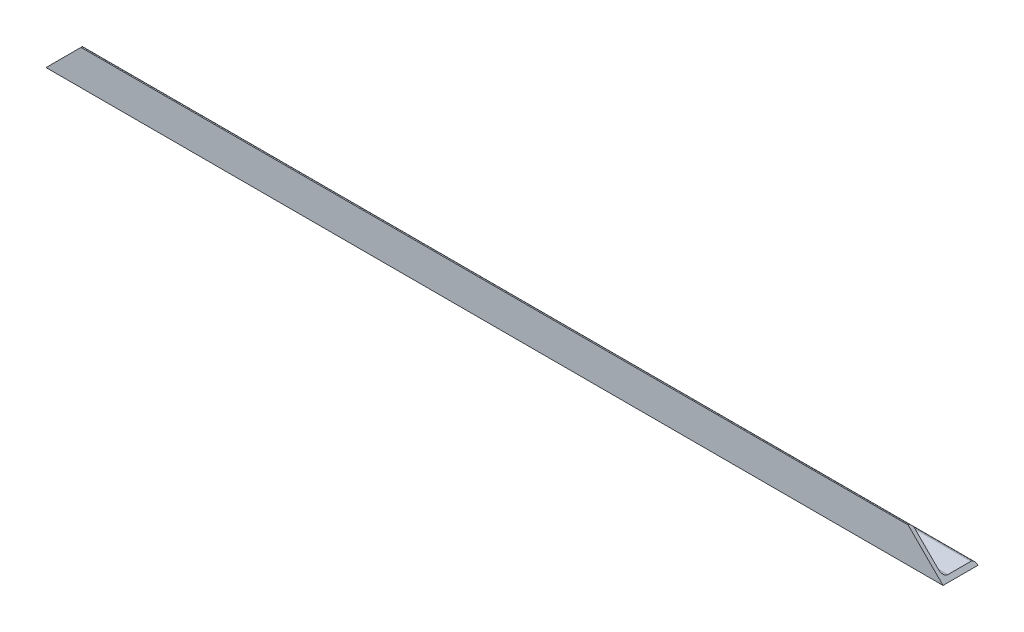
ISO-10303-21;
HEADER;
FILE_DESCRIPTION(('STEP AP214'),'2;1');
FILE_NAME('part.step','',(''),(''),'','','');
FILE_SCHEMA(('AUTOMOTIVE_DESIGN { 1 0 10303 214 1 1 1 1 }'));
ENDSEC;
DATA;
#1=APPLICATION_CONTEXT('core data for automotive mechanical design processes');
#2=APPLICATION_PROTOCOL_DEFINITION('international standard','automotive_design',2000,#1);
#3=PRODUCT_CONTEXT('',#1,'mechanical');
#4=PRODUCT('Part','Part','',(#3));
#5=PRODUCT_RELATED_PRODUCT_CATEGORY('part','',(#4));
#6=PRODUCT_DEFINITION_FORMATION('','',#4);
#7=PRODUCT_DEFINITION_CONTEXT('part definition',#1,'design');
#8=PRODUCT_DEFINITION('design','',#6,#7);
#9=PRODUCT_DEFINITION_SHAPE('','',#8);
#10=(LENGTH_UNIT() NAMED_UNIT(*) SI_UNIT(.MILLI.,.METRE.));
#11=(NAMED_UNIT(*) PLANE_ANGLE_UNIT() SI_UNIT($,.RADIAN.));
#12=(NAMED_UNIT(*) SI_UNIT($,.STERADIAN.) SOLID_ANGLE_UNIT());
#13=UNCERTAINTY_MEASURE_WITH_UNIT(LENGTH_MEASURE(1.E-05),#10,'distance_accuracy_value','');
#14=(GEOMETRIC_REPRESENTATION_CONTEXT(3) GLOBAL_UNCERTAINTY_ASSIGNED_CONTEXT((#13)) GLOBAL_UNIT_ASSIGNED_CONTEXT((#10,
#11,#12)) REPRESENTATION_CONTEXT('',''));
#15=CARTESIAN_POINT('',(0.,0.,0.));
#16=DIRECTION('',(0.,0.,1.));
#17=DIRECTION('',(1.,0.,0.));
#18=AXIS2_PLACEMENT_3D('',#15,#16,#17);
#19=CARTESIAN_POINT('',(1540.,0.,-60.));
#20=DIRECTION('',(0.,1.,0.));
#21=DIRECTION('',(0.,0.,1.));
#22=AXIS2_PLACEMENT_3D('',#19,#20,#21);
#23=PLANE('',#22);
#24=DIRECTION('',(0.,0.,-1.));
#25=VECTOR('',#24,1.);
#26=CARTESIAN_POINT('',(0.,0.,-60.));
#27=LINE('',#26,#25);
#28=CARTESIAN_POINT('',(0.,0.,0.));
#29=VERTEX_POINT('',#28);
#30=CARTESIAN_POINT('',(0.,0.,-60.));
#31=VERTEX_POINT('',#30);
#32=EDGE_CURVE('E122',#29,#31,#27,.T.);
#33=ORIENTED_EDGE('',*,*,#32,.T.);
#34=DIRECTION('',(-1.,0.,0.));
#35=VECTOR('',#34,1.);
#36=CARTESIAN_POINT('',(1540.,0.,-60.));
#37=LINE('',#36,#35);
#38=CARTESIAN_POINT('',(1540.,0.,-60.));
#39=VERTEX_POINT('',#38);
#40=EDGE_CURVE('E13',#39,#31,#37,.T.);
#41=ORIENTED_EDGE('',*,*,#40,.F.);
#42=DIRECTION('',(0.,0.,-1.));
#43=VECTOR('',#42,1.);
#44=CARTESIAN_POINT('',(1540.,0.,-60.));
#45=LINE('',#44,#43);
#46=CARTESIAN_POINT('',(1540.,0.,0.));
#47=VERTEX_POINT('',#46);
#48=EDGE_CURVE('E142',#47,#39,#45,.T.);
#49=ORIENTED_EDGE('',*,*,#48,.F.);
#50=DIRECTION('',(-1.,0.,0.));
#51=VECTOR('',#50,1.);
#52=CARTESIAN_POINT('',(1540.,0.,0.));
#53=LINE('',#52,#51);
#54=EDGE_CURVE('E138',#47,#29,#53,.T.);
#55=ORIENTED_EDGE('',*,*,#54,.T.);
#56=EDGE_LOOP('',(#33,#41,#49,#55));
#57=FACE_BOUND('',#56,.T.);
#58=ADVANCED_FACE('F63',(#57),#23,.F.);
#59=CARTESIAN_POINT('',(1540.,0.,-54.));
#60=DIRECTION('',(-1.,0.,0.));
#61=DIRECTION('',(0.,0.,1.));
#62=AXIS2_PLACEMENT_3D('',#59,#60,#61);
#63=CYLINDRICAL_SURFACE('',#62,6.);
#64=ORIENTED_EDGE('',*,*,#40,.T.);
#65=CARTESIAN_POINT('',(-2.22044604925031E-13,0.,-54.));
#66=DIRECTION('',(0.707106781186546,-0.707106781186549,0.));
#67=DIRECTION('',(-0.707106781186549,-0.707106781186546,0.));
#68=AXIS2_PLACEMENT_3D('',#65,#66,#67);
#69=ELLIPSE('',#68,8.48528137423859,6.);
#70=CARTESIAN_POINT('',(5.99999999999978,6.,-54.));
#71=VERTEX_POINT('',#70);
#72=EDGE_CURVE('E165',#31,#71,#69,.T.);
#73=ORIENTED_EDGE('',*,*,#72,.T.);
#74=DIRECTION('',(-1.,0.,0.));
#75=VECTOR('',#74,1.);
#76=CARTESIAN_POINT('',(1540.,6.,-54.));
#77=LINE('',#76,#75);
#78=CARTESIAN_POINT('',(1534.,6.,-54.));
#79=VERTEX_POINT('',#78);
#80=EDGE_CURVE('E71',#79,#71,#77,.T.);
#81=ORIENTED_EDGE('',*,*,#80,.F.);
#82=CARTESIAN_POINT('',(1540.,0.,-54.));
#83=DIRECTION('',(-0.707106781186547,-0.707106781186548,0.));
#84=DIRECTION('',(-0.707106781186548,0.707106781186547,0.));
#85=AXIS2_PLACEMENT_3D('',#82,#83,#84);
#86=ELLIPSE('',#85,8.48528137423857,6.);
#87=EDGE_CURVE('E163',#79,#39,#86,.T.);
#88=ORIENTED_EDGE('',*,*,#87,.T.);
#89=EDGE_LOOP('',(#64,#73,#81,#88));
#90=FACE_BOUND('',#89,.T.);
#91=ADVANCED_FACE('F162',(#90),#63,.T.);
#92=CARTESIAN_POINT('',(1540.,6.,-14.));
#93=DIRECTION('',(0.,-1.,0.));
#94=DIRECTION('',(0.,0.,-1.));
#95=AXIS2_PLACEMENT_3D('',#92,#93,#94);
#96=PLANE('',#95);
#97=ORIENTED_EDGE('',*,*,#80,.T.);
#98=DIRECTION('',(0.,0.,1.));
#99=VECTOR('',#98,1.);
#100=CARTESIAN_POINT('',(5.99999999999978,6.,-14.));
#101=LINE('',#100,#99);
#102=CARTESIAN_POINT('',(6.00000000000001,6.,-14.));
#103=VERTEX_POINT('',#102);
#104=EDGE_CURVE('E157',#71,#103,#101,.T.);
#105=ORIENTED_EDGE('',*,*,#104,.T.);
#106=DIRECTION('',(-1.,0.,0.));
#107=VECTOR('',#106,1.);
#108=CARTESIAN_POINT('',(1540.,6.,-14.));
#109=LINE('',#108,#107);
#110=CARTESIAN_POINT('',(1534.,6.,-14.));
#111=VERTEX_POINT('',#110);
#112=EDGE_CURVE('E148',#111,#103,#109,.T.);
#113=ORIENTED_EDGE('',*,*,#112,.F.);
#114=DIRECTION('',(0.,0.,-1.));
#115=VECTOR('',#114,1.);
#116=CARTESIAN_POINT('',(1534.,6.,-14.));
#117=LINE('',#116,#115);
#118=EDGE_CURVE('E158',#111,#79,#117,.T.);
#119=ORIENTED_EDGE('',*,*,#118,.T.);
#120=EDGE_LOOP('',(#97,#105,#113,#119));
#121=FACE_BOUND('',#120,.T.);
#122=ADVANCED_FACE('F155',(#121),#96,.F.);
#123=CARTESIAN_POINT('',(1540.,14.,-14.));
#124=DIRECTION('',(-1.,0.,0.));
#125=DIRECTION('',(0.,0.,1.));
#126=AXIS2_PLACEMENT_3D('',#123,#124,#125);
#127=CYLINDRICAL_SURFACE('',#126,8.);
#128=ORIENTED_EDGE('',*,*,#112,.T.);
#129=CARTESIAN_POINT('',(14.,14.,-14.));
#130=DIRECTION('',(0.707106781186546,-0.707106781186549,0.));
#131=DIRECTION('',(-0.707106781186549,-0.707106781186546,0.));
#132=AXIS2_PLACEMENT_3D('',#129,#130,#131);
#133=ELLIPSE('',#132,11.3137084989848,8.);
#134=CARTESIAN_POINT('',(14.,14.,-6.));
#135=VERTEX_POINT('',#134);
#136=EDGE_CURVE('E170',#103,#135,#133,.F.);
#137=ORIENTED_EDGE('',*,*,#136,.T.);
#138=DIRECTION('',(-1.,0.,0.));
#139=VECTOR('',#138,1.);
#140=CARTESIAN_POINT('',(1540.,14.,-6.));
#141=LINE('',#140,#139);
#142=CARTESIAN_POINT('',(1526.,14.,-6.));
#143=VERTEX_POINT('',#142);
#144=EDGE_CURVE('E140',#143,#135,#141,.T.);
#145=ORIENTED_EDGE('',*,*,#144,.F.);
#146=CARTESIAN_POINT('',(1526.,14.,-14.));
#147=DIRECTION('',(-0.707106781186547,-0.707106781186548,0.));
#148=DIRECTION('',(-0.707106781186548,0.707106781186547,0.));
#149=AXIS2_PLACEMENT_3D('',#146,#147,#148);
#150=ELLIPSE('',#149,11.3137084989848,8.);
#151=EDGE_CURVE('E176',#143,#111,#150,.F.);
#152=ORIENTED_EDGE('',*,*,#151,.T.);
#153=EDGE_LOOP('',(#128,#137,#145,#152));
#154=FACE_BOUND('',#153,.T.);
#155=ADVANCED_FACE('F186',(#154),#127,.F.);
#156=CARTESIAN_POINT('',(1540.,54.,-6.));
#157=DIRECTION('',(0.,0.,1.));
#158=DIRECTION('',(1.,0.,0.));
#159=AXIS2_PLACEMENT_3D('',#156,#157,#158);
#160=PLANE('',#159);
#161=ORIENTED_EDGE('',*,*,#144,.T.);
#162=DIRECTION('',(0.707106781186549,0.707106781186546,0.));
#163=VECTOR('',#162,1.);
#164=CARTESIAN_POINT('',(797.000000000003,797.,-6.));
#165=LINE('',#164,#163);
#166=CARTESIAN_POINT('',(54.,54.,-6.));
#167=VERTEX_POINT('',#166);
#168=EDGE_CURVE('E135',#135,#167,#165,.T.);
#169=ORIENTED_EDGE('',*,*,#168,.T.);
#170=DIRECTION('',(-1.,0.,0.));
#171=VECTOR('',#170,1.);
#172=CARTESIAN_POINT('',(1540.,54.,-6.));
#173=LINE('',#172,#171);
#174=CARTESIAN_POINT('',(1486.,54.,-6.));
#175=VERTEX_POINT('',#174);
#176=EDGE_CURVE('E134',#175,#167,#173,.T.);
#177=ORIENTED_EDGE('',*,*,#176,.F.);
#178=DIRECTION('',(0.707106781186548,-0.707106781186547,0.));
#179=VECTOR('',#178,1.);
#180=CARTESIAN_POINT('',(1513.,27.,-6.));
#181=LINE('',#180,#179);
#182=EDGE_CURVE('E168',#175,#143,#181,.T.);
#183=ORIENTED_EDGE('',*,*,#182,.T.);
#184=EDGE_LOOP('',(#161,#169,#177,#183));
#185=FACE_BOUND('',#184,.T.);
#186=ADVANCED_FACE('F189',(#185),#160,.F.);
#187=CARTESIAN_POINT('',(1540.,54.,0.));
#188=DIRECTION('',(-1.,0.,0.));
#189=DIRECTION('',(0.,0.,1.));
#190=AXIS2_PLACEMENT_3D('',#187,#188,#189);
#191=CYLINDRICAL_SURFACE('',#190,6.);
#192=ORIENTED_EDGE('',*,*,#176,.T.);
#193=CARTESIAN_POINT('',(54.,54.,0.));
#194=DIRECTION('',(0.707106781186546,-0.707106781186549,0.));
#195=DIRECTION('',(-0.707106781186549,-0.707106781186546,0.));
#196=AXIS2_PLACEMENT_3D('',#193,#194,#195);
#197=ELLIPSE('',#196,8.48528137423859,6.);
#198=CARTESIAN_POINT('',(60.0000000000001,59.9999999999998,0.));
#199=VERTEX_POINT('',#198);
#200=EDGE_CURVE('E119',#167,#199,#197,.T.);
#201=ORIENTED_EDGE('',*,*,#200,.T.);
#202=DIRECTION('',(-1.,0.,0.));
#203=VECTOR('',#202,1.);
#204=CARTESIAN_POINT('',(1540.,60.,0.));
#205=LINE('',#204,#203);
#206=CARTESIAN_POINT('',(1480.,60.,0.));
#207=VERTEX_POINT('',#206);
#208=EDGE_CURVE('E132',#207,#199,#205,.T.);
#209=ORIENTED_EDGE('',*,*,#208,.F.);
#210=CARTESIAN_POINT('',(1486.,54.,0.));
#211=DIRECTION('',(-0.707106781186547,-0.707106781186548,0.));
#212=DIRECTION('',(-0.707106781186548,0.707106781186547,0.));
#213=AXIS2_PLACEMENT_3D('',#210,#211,#212);
#214=ELLIPSE('',#213,8.48528137423858,6.);
#215=EDGE_CURVE('E166',#207,#175,#214,.T.);
#216=ORIENTED_EDGE('',*,*,#215,.T.);
#217=EDGE_LOOP('',(#192,#201,#209,#216));
#218=FACE_BOUND('',#217,.T.);
#219=ADVANCED_FACE('F130',(#218),#191,.T.);
#220=CARTESIAN_POINT('',(1540.,60.,0.));
#221=DIRECTION('',(0.,0.,-1.));
#222=DIRECTION('',(-1.,0.,0.));
#223=AXIS2_PLACEMENT_3D('',#220,#221,#222);
#224=PLANE('',#223);
#225=ORIENTED_EDGE('',*,*,#208,.T.);
#226=DIRECTION('',(0.707106781186549,0.707106781186546,0.));
#227=VECTOR('',#226,1.);
#228=CARTESIAN_POINT('',(60.0000000000001,59.9999999999998,0.));
#229=LINE('',#228,#227);
#230=EDGE_CURVE('E116',#29,#199,#229,.T.);
#231=ORIENTED_EDGE('',*,*,#230,.F.);
#232=ORIENTED_EDGE('',*,*,#54,.F.);
#233=DIRECTION('',(0.707106781186548,-0.707106781186547,0.));
#234=VECTOR('',#233,1.);
#235=CARTESIAN_POINT('',(1480.,60.,0.));
#236=LINE('',#235,#234);
#237=EDGE_CURVE('E77',#207,#47,#236,.T.);
#238=ORIENTED_EDGE('',*,*,#237,.F.);
#239=EDGE_LOOP('',(#225,#231,#232,#238));
#240=FACE_BOUND('',#239,.T.);
#241=ADVANCED_FACE('F137',(#240),#224,.F.);
#242=CARTESIAN_POINT('',(60.0000000000001,59.9999999999998,-60.));
#243=DIRECTION('',(0.707106781186546,-0.707106781186549,0.));
#244=DIRECTION('',(0.707106781186549,0.707106781186546,0.));
#245=AXIS2_PLACEMENT_3D('',#242,#243,#244);
#246=PLANE('',#245);
#247=ORIENTED_EDGE('',*,*,#32,.F.);
#248=ORIENTED_EDGE('',*,*,#230,.T.);
#249=ORIENTED_EDGE('',*,*,#200,.F.);
#250=ORIENTED_EDGE('',*,*,#168,.F.);
#251=ORIENTED_EDGE('',*,*,#136,.F.);
#252=ORIENTED_EDGE('',*,*,#104,.F.);
#253=ORIENTED_EDGE('',*,*,#72,.F.);
#254=EDGE_LOOP('',(#247,#248,#249,#250,#251,#252,#253));
#255=FACE_BOUND('',#254,.T.);
#256=ADVANCED_FACE('F118',(#255),#246,.F.);
#257=CARTESIAN_POINT('',(1480.,60.,-60.));
#258=DIRECTION('',(-0.707106781186547,-0.707106781186548,0.));
#259=DIRECTION('',(0.707106781186548,-0.707106781186547,0.));
#260=AXIS2_PLACEMENT_3D('',#257,#258,#259);
#261=PLANE('',#260);
#262=ORIENTED_EDGE('',*,*,#118,.F.);
#263=ORIENTED_EDGE('',*,*,#151,.F.);
#264=ORIENTED_EDGE('',*,*,#182,.F.);
#265=ORIENTED_EDGE('',*,*,#215,.F.);
#266=ORIENTED_EDGE('',*,*,#237,.T.);
#267=ORIENTED_EDGE('',*,*,#48,.T.);
#268=ORIENTED_EDGE('',*,*,#87,.F.);
#269=EDGE_LOOP('',(#262,#263,#264,#265,#266,#267,#268));
#270=FACE_BOUND('',#269,.T.);
#271=ADVANCED_FACE('F183',(#270),#261,.F.);
#272=CLOSED_SHELL('',(#58,#91,#122,#155,#186,#219,#241,#256,#271));
#273=MANIFOLD_SOLID_BREP('B2',#272);
#274=ADVANCED_BREP_SHAPE_REPRESENTATION('',(#18,#273),#14);
#275=SHAPE_DEFINITION_REPRESENTATION(#9,#274);
ENDSEC;
END-ISO-10303-21;
